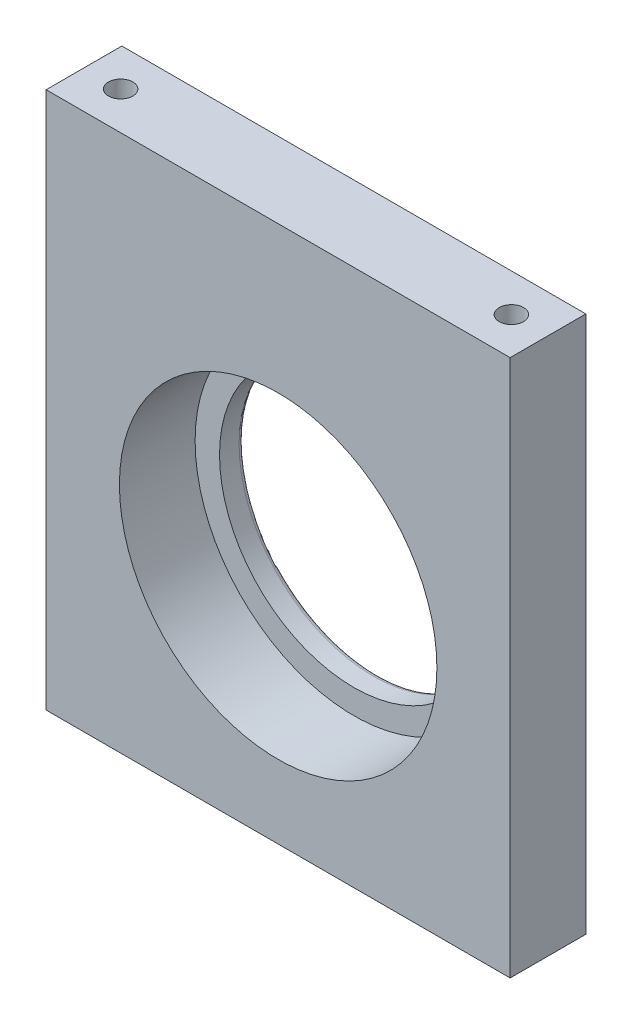
ISO-10303-21;
HEADER;
FILE_DESCRIPTION(('STEP AP214'),'2;1');
FILE_NAME('part.step','',(''),(''),'','','');
FILE_SCHEMA(('AUTOMOTIVE_DESIGN { 1 0 10303 214 1 1 1 1 }'));
ENDSEC;
DATA;
#1=APPLICATION_CONTEXT('core data for automotive mechanical design processes');
#2=APPLICATION_PROTOCOL_DEFINITION('international standard','automotive_design',2000,#1);
#3=PRODUCT_CONTEXT('',#1,'mechanical');
#4=PRODUCT('Part','Part','',(#3));
#5=PRODUCT_RELATED_PRODUCT_CATEGORY('part','',(#4));
#6=PRODUCT_DEFINITION_FORMATION('','',#4);
#7=PRODUCT_DEFINITION_CONTEXT('part definition',#1,'design');
#8=PRODUCT_DEFINITION('design','',#6,#7);
#9=PRODUCT_DEFINITION_SHAPE('','',#8);
#10=(LENGTH_UNIT() NAMED_UNIT(*) SI_UNIT(.MILLI.,.METRE.));
#11=(NAMED_UNIT(*) PLANE_ANGLE_UNIT() SI_UNIT($,.RADIAN.));
#12=(NAMED_UNIT(*) SI_UNIT($,.STERADIAN.) SOLID_ANGLE_UNIT());
#13=UNCERTAINTY_MEASURE_WITH_UNIT(LENGTH_MEASURE(1.E-05),#10,'distance_accuracy_value','');
#14=(GEOMETRIC_REPRESENTATION_CONTEXT(3) GLOBAL_UNCERTAINTY_ASSIGNED_CONTEXT((#13)) GLOBAL_UNIT_ASSIGNED_CONTEXT((#10,
#11,#12)) REPRESENTATION_CONTEXT('',''));
#15=CARTESIAN_POINT('',(0.,0.,0.));
#16=DIRECTION('',(0.,0.,1.));
#17=DIRECTION('',(1.,0.,0.));
#18=AXIS2_PLACEMENT_3D('',#15,#16,#17);
#19=CARTESIAN_POINT('',(0.,0.,31.));
#20=DIRECTION('',(0.,0.,1.));
#21=DIRECTION('',(1.,0.,0.));
#22=AXIS2_PLACEMENT_3D('',#19,#20,#21);
#23=PLANE('',#22);
#24=DIRECTION('',(0.,1.,0.));
#25=VECTOR('',#24,1.);
#26=CARTESIAN_POINT('',(95.,0.,31.));
#27=LINE('',#26,#25);
#28=CARTESIAN_POINT('',(95.,0.,31.));
#29=VERTEX_POINT('',#28);
#30=CARTESIAN_POINT('',(95.,220.,31.));
#31=VERTEX_POINT('',#30);
#32=EDGE_CURVE('E165',#29,#31,#27,.T.);
#33=ORIENTED_EDGE('',*,*,#32,.T.);
#34=DIRECTION('',(-1.,0.,0.));
#35=VECTOR('',#34,1.);
#36=CARTESIAN_POINT('',(95.,220.,31.));
#37=LINE('',#36,#35);
#38=CARTESIAN_POINT('',(-95.,220.,31.));
#39=VERTEX_POINT('',#38);
#40=EDGE_CURVE('E168',#31,#39,#37,.T.);
#41=ORIENTED_EDGE('',*,*,#40,.T.);
#42=DIRECTION('',(0.,-1.,0.));
#43=VECTOR('',#42,1.);
#44=CARTESIAN_POINT('',(-95.,220.,31.));
#45=LINE('',#44,#43);
#46=CARTESIAN_POINT('',(-95.,0.,31.));
#47=VERTEX_POINT('',#46);
#48=EDGE_CURVE('E171',#39,#47,#45,.T.);
#49=ORIENTED_EDGE('',*,*,#48,.T.);
#50=DIRECTION('',(1.,0.,0.));
#51=VECTOR('',#50,1.);
#52=CARTESIAN_POINT('',(-95.,0.,31.));
#53=LINE('',#52,#51);
#54=EDGE_CURVE('E173',#47,#29,#53,.T.);
#55=ORIENTED_EDGE('',*,*,#54,.T.);
#56=EDGE_LOOP('',(#33,#41,#49,#55));
#57=FACE_BOUND('',#56,.T.);
#58=CARTESIAN_POINT('',(0.,95.,31.));
#59=DIRECTION('',(0.,0.,1.));
#60=DIRECTION('',(1.,0.,0.));
#61=AXIS2_PLACEMENT_3D('',#58,#59,#60);
#62=CIRCLE('',#61,65.);
#63=CARTESIAN_POINT('',(65.,95.,31.));
#64=VERTEX_POINT('',#63);
#65=EDGE_CURVE('E159',#64,#64,#62,.T.);
#66=ORIENTED_EDGE('',*,*,#65,.F.);
#67=EDGE_LOOP('',(#66));
#68=FACE_BOUND('',#67,.T.);
#69=ADVANCED_FACE('F33',(#57,#68),#23,.T.);
#70=CARTESIAN_POINT('',(0.,0.,0.));
#71=DIRECTION('',(0.,0.,1.));
#72=DIRECTION('',(1.,0.,0.));
#73=AXIS2_PLACEMENT_3D('',#70,#71,#72);
#74=PLANE('',#73);
#75=DIRECTION('',(1.,0.,0.));
#76=VECTOR('',#75,1.);
#77=CARTESIAN_POINT('',(0.,18.,0.));
#78=LINE('',#77,#76);
#79=CARTESIAN_POINT('',(-77.,18.,0.));
#80=VERTEX_POINT('',#79);
#81=CARTESIAN_POINT('',(77.,18.,0.));
#82=VERTEX_POINT('',#81);
#83=EDGE_CURVE('E204',#80,#82,#78,.T.);
#84=ORIENTED_EDGE('',*,*,#83,.T.);
#85=DIRECTION('',(0.,1.,0.));
#86=VECTOR('',#85,1.);
#87=CARTESIAN_POINT('',(77.,0.,0.));
#88=LINE('',#87,#86);
#89=CARTESIAN_POINT('',(77.,172.,0.));
#90=VERTEX_POINT('',#89);
#91=EDGE_CURVE('E206',#82,#90,#88,.T.);
#92=ORIENTED_EDGE('',*,*,#91,.T.);
#93=DIRECTION('',(-1.,0.,0.));
#94=VECTOR('',#93,1.);
#95=CARTESIAN_POINT('',(0.,172.,0.));
#96=LINE('',#95,#94);
#97=CARTESIAN_POINT('',(-77.,172.,0.));
#98=VERTEX_POINT('',#97);
#99=EDGE_CURVE('E200',#90,#98,#96,.T.);
#100=ORIENTED_EDGE('',*,*,#99,.T.);
#101=DIRECTION('',(0.,-1.,0.));
#102=VECTOR('',#101,1.);
#103=CARTESIAN_POINT('',(-77.,0.,0.));
#104=LINE('',#103,#102);
#105=EDGE_CURVE('E202',#98,#80,#104,.T.);
#106=ORIENTED_EDGE('',*,*,#105,.T.);
#107=EDGE_LOOP('',(#84,#92,#100,#106));
#108=FACE_BOUND('',#107,.T.);
#109=DIRECTION('',(0.,1.,0.));
#110=VECTOR('',#109,1.);
#111=CARTESIAN_POINT('',(95.,0.,0.));
#112=LINE('',#111,#110);
#113=CARTESIAN_POINT('',(95.,0.,0.));
#114=VERTEX_POINT('',#113);
#115=CARTESIAN_POINT('',(95.,220.,0.));
#116=VERTEX_POINT('',#115);
#117=EDGE_CURVE('E162',#114,#116,#112,.T.);
#118=ORIENTED_EDGE('',*,*,#117,.F.);
#119=DIRECTION('',(1.,0.,0.));
#120=VECTOR('',#119,1.);
#121=CARTESIAN_POINT('',(-95.,0.,0.));
#122=LINE('',#121,#120);
#123=CARTESIAN_POINT('',(-95.,0.,0.));
#124=VERTEX_POINT('',#123);
#125=EDGE_CURVE('E169',#124,#114,#122,.T.);
#126=ORIENTED_EDGE('',*,*,#125,.F.);
#127=DIRECTION('',(0.,-1.,0.));
#128=VECTOR('',#127,1.);
#129=CARTESIAN_POINT('',(-95.,220.,0.));
#130=LINE('',#129,#128);
#131=CARTESIAN_POINT('',(-95.,220.,0.));
#132=VERTEX_POINT('',#131);
#133=EDGE_CURVE('E180',#132,#124,#130,.T.);
#134=ORIENTED_EDGE('',*,*,#133,.F.);
#135=DIRECTION('',(-1.,0.,0.));
#136=VECTOR('',#135,1.);
#137=CARTESIAN_POINT('',(95.,220.,0.));
#138=LINE('',#137,#136);
#139=EDGE_CURVE('E178',#116,#132,#138,.T.);
#140=ORIENTED_EDGE('',*,*,#139,.F.);
#141=EDGE_LOOP('',(#118,#126,#134,#140));
#142=FACE_BOUND('',#141,.T.);
#143=ADVANCED_FACE('F245',(#108,#142),#74,.F.);
#144=CARTESIAN_POINT('',(95.,0.,31.));
#145=DIRECTION('',(-1.,0.,0.));
#146=DIRECTION('',(0.,-1.,0.));
#147=AXIS2_PLACEMENT_3D('',#144,#145,#146);
#148=PLANE('',#147);
#149=ORIENTED_EDGE('',*,*,#117,.T.);
#150=DIRECTION('',(0.,0.,-1.));
#151=VECTOR('',#150,1.);
#152=CARTESIAN_POINT('',(95.,220.,31.));
#153=LINE('',#152,#151);
#154=EDGE_CURVE('E191',#31,#116,#153,.T.);
#155=ORIENTED_EDGE('',*,*,#154,.F.);
#156=ORIENTED_EDGE('',*,*,#32,.F.);
#157=DIRECTION('',(0.,0.,-1.));
#158=VECTOR('',#157,1.);
#159=CARTESIAN_POINT('',(95.,0.,31.));
#160=LINE('',#159,#158);
#161=EDGE_CURVE('E175',#29,#114,#160,.T.);
#162=ORIENTED_EDGE('',*,*,#161,.T.);
#163=EDGE_LOOP('',(#149,#155,#156,#162));
#164=FACE_BOUND('',#163,.T.);
#165=ADVANCED_FACE('F251',(#164),#148,.F.);
#166=CARTESIAN_POINT('',(95.,220.,31.));
#167=DIRECTION('',(0.,-1.,0.));
#168=DIRECTION('',(1.,0.,0.));
#169=AXIS2_PLACEMENT_3D('',#166,#167,#168);
#170=PLANE('',#169);
#171=CARTESIAN_POINT('',(80.,220.,15.5));
#172=DIRECTION('',(0.,-1.,0.));
#173=DIRECTION('',(1.,0.,0.));
#174=AXIS2_PLACEMENT_3D('',#171,#172,#173);
#175=CIRCLE('',#174,5.);
#176=CARTESIAN_POINT('',(75.,220.,15.5));
#177=VERTEX_POINT('',#176);
#178=EDGE_CURVE('E143',#177,#177,#175,.T.);
#179=ORIENTED_EDGE('',*,*,#178,.T.);
#180=EDGE_LOOP('',(#179));
#181=FACE_BOUND('',#180,.T.);
#182=CARTESIAN_POINT('',(-80.,220.,15.5));
#183=DIRECTION('',(0.,1.,0.));
#184=DIRECTION('',(-1.,0.,0.));
#185=AXIS2_PLACEMENT_3D('',#182,#183,#184);
#186=CIRCLE('',#185,5.);
#187=CARTESIAN_POINT('',(-85.,220.,15.5));
#188=VERTEX_POINT('',#187);
#189=EDGE_CURVE('E150',#188,#188,#186,.T.);
#190=ORIENTED_EDGE('',*,*,#189,.F.);
#191=EDGE_LOOP('',(#190));
#192=FACE_BOUND('',#191,.T.);
#193=ORIENTED_EDGE('',*,*,#139,.T.);
#194=DIRECTION('',(0.,0.,-1.));
#195=VECTOR('',#194,1.);
#196=CARTESIAN_POINT('',(-95.,220.,31.));
#197=LINE('',#196,#195);
#198=EDGE_CURVE('E188',#39,#132,#197,.T.);
#199=ORIENTED_EDGE('',*,*,#198,.F.);
#200=ORIENTED_EDGE('',*,*,#40,.F.);
#201=ORIENTED_EDGE('',*,*,#154,.T.);
#202=EDGE_LOOP('',(#193,#199,#200,#201));
#203=FACE_BOUND('',#202,.T.);
#204=ADVANCED_FACE('F266',(#181,#192,#203),#170,.F.);
#205=CARTESIAN_POINT('',(-95.,220.,31.));
#206=DIRECTION('',(1.,0.,0.));
#207=DIRECTION('',(0.,1.,0.));
#208=AXIS2_PLACEMENT_3D('',#205,#206,#207);
#209=PLANE('',#208);
#210=ORIENTED_EDGE('',*,*,#133,.T.);
#211=DIRECTION('',(0.,0.,-1.));
#212=VECTOR('',#211,1.);
#213=CARTESIAN_POINT('',(-95.,0.,31.));
#214=LINE('',#213,#212);
#215=EDGE_CURVE('E185',#47,#124,#214,.T.);
#216=ORIENTED_EDGE('',*,*,#215,.F.);
#217=ORIENTED_EDGE('',*,*,#48,.F.);
#218=ORIENTED_EDGE('',*,*,#198,.T.);
#219=EDGE_LOOP('',(#210,#216,#217,#218));
#220=FACE_BOUND('',#219,.T.);
#221=ADVANCED_FACE('F262',(#220),#209,.F.);
#222=CARTESIAN_POINT('',(-95.,0.,31.));
#223=DIRECTION('',(0.,1.,0.));
#224=DIRECTION('',(0.,0.,1.));
#225=AXIS2_PLACEMENT_3D('',#222,#223,#224);
#226=PLANE('',#225);
#227=ORIENTED_EDGE('',*,*,#125,.T.);
#228=ORIENTED_EDGE('',*,*,#161,.F.);
#229=ORIENTED_EDGE('',*,*,#54,.F.);
#230=ORIENTED_EDGE('',*,*,#215,.T.);
#231=EDGE_LOOP('',(#227,#228,#229,#230));
#232=FACE_BOUND('',#231,.T.);
#233=ADVANCED_FACE('F259',(#232),#226,.F.);
#234=CARTESIAN_POINT('',(0.,95.,31.));
#235=DIRECTION('',(0.,0.,-1.));
#236=DIRECTION('',(-1.,0.,0.));
#237=AXIS2_PLACEMENT_3D('',#234,#235,#236);
#238=CYLINDRICAL_SURFACE('',#237,65.);
#239=ORIENTED_EDGE('',*,*,#65,.T.);
#240=EDGE_LOOP('',(#239));
#241=FACE_BOUND('',#240,.T.);
#242=CARTESIAN_POINT('',(0.,95.,0.));
#243=DIRECTION('',(0.,0.,1.));
#244=DIRECTION('',(1.,0.,0.));
#245=AXIS2_PLACEMENT_3D('',#242,#243,#244);
#246=CIRCLE('',#245,65.);
#247=CARTESIAN_POINT('',(65.,95.,0.));
#248=VERTEX_POINT('',#247);
#249=EDGE_CURVE('E156',#248,#248,#246,.T.);
#250=ORIENTED_EDGE('',*,*,#249,.F.);
#251=EDGE_LOOP('',(#250));
#252=FACE_BOUND('',#251,.T.);
#253=ADVANCED_FACE('F256',(#241,#252),#238,.F.);
#254=CARTESIAN_POINT('',(-80.,205.,15.5));
#255=DIRECTION('',(0.,1.,0.));
#256=DIRECTION('',(-1.,0.,0.));
#257=AXIS2_PLACEMENT_3D('',#254,#255,#256);
#258=CYLINDRICAL_SURFACE('',#257,5.);
#259=CARTESIAN_POINT('',(-80.,205.,15.5));
#260=DIRECTION('',(0.,1.,0.));
#261=DIRECTION('',(-1.,0.,0.));
#262=AXIS2_PLACEMENT_3D('',#259,#260,#261);
#263=CIRCLE('',#262,5.);
#264=CARTESIAN_POINT('',(-85.,205.,15.5));
#265=VERTEX_POINT('',#264);
#266=EDGE_CURVE('E153',#265,#265,#263,.T.);
#267=CARTESIAN_POINT('',(-85.,205.,15.5));
#268=CARTESIAN_POINT('',(-85.,205.15625,15.5));
#269=CARTESIAN_POINT('',(-85.,205.3125,15.5));
#270=CARTESIAN_POINT('',(-85.,205.625,15.5));
#271=CARTESIAN_POINT('',(-85.,205.78125,15.5));
#272=CARTESIAN_POINT('',(-85.,206.09375,15.5));
#273=CARTESIAN_POINT('',(-85.,206.25,15.5));
#274=CARTESIAN_POINT('',(-85.,206.5625,15.5));
#275=CARTESIAN_POINT('',(-85.,206.71875,15.5));
#276=CARTESIAN_POINT('',(-85.,207.03125,15.5));
#277=CARTESIAN_POINT('',(-85.,207.1875,15.5));
#278=CARTESIAN_POINT('',(-85.,207.5,15.5));
#279=CARTESIAN_POINT('',(-85.,207.65625,15.5));
#280=CARTESIAN_POINT('',(-85.,207.96875,15.5));
#281=CARTESIAN_POINT('',(-85.,208.125,15.5));
#282=CARTESIAN_POINT('',(-85.,208.4375,15.5));
#283=CARTESIAN_POINT('',(-85.,208.59375,15.5));
#284=CARTESIAN_POINT('',(-85.,208.90625,15.5));
#285=CARTESIAN_POINT('',(-85.,209.0625,15.5));
#286=CARTESIAN_POINT('',(-85.,209.375,15.5));
#287=CARTESIAN_POINT('',(-85.,209.53125,15.5));
#288=CARTESIAN_POINT('',(-85.,209.84375,15.5));
#289=CARTESIAN_POINT('',(-85.,210.,15.5));
#290=CARTESIAN_POINT('',(-85.,210.3125,15.5));
#291=CARTESIAN_POINT('',(-85.,210.46875,15.5));
#292=CARTESIAN_POINT('',(-85.,210.78125,15.5));
#293=CARTESIAN_POINT('',(-85.,210.9375,15.5));
#294=CARTESIAN_POINT('',(-85.,211.25,15.5));
#295=CARTESIAN_POINT('',(-85.,211.40625,15.5));
#296=CARTESIAN_POINT('',(-85.,211.71875,15.5));
#297=CARTESIAN_POINT('',(-85.,211.875,15.5));
#298=CARTESIAN_POINT('',(-85.,212.1875,15.5));
#299=CARTESIAN_POINT('',(-85.,212.34375,15.5));
#300=CARTESIAN_POINT('',(-85.,212.65625,15.5));
#301=CARTESIAN_POINT('',(-85.,212.8125,15.5));
#302=CARTESIAN_POINT('',(-85.,213.125,15.5));
#303=CARTESIAN_POINT('',(-85.,213.28125,15.5));
#304=CARTESIAN_POINT('',(-85.,213.59375,15.5));
#305=CARTESIAN_POINT('',(-85.,213.75,15.5));
#306=CARTESIAN_POINT('',(-85.,214.0625,15.5));
#307=CARTESIAN_POINT('',(-85.,214.21875,15.5));
#308=CARTESIAN_POINT('',(-85.,214.53125,15.5));
#309=CARTESIAN_POINT('',(-85.,214.6875,15.5));
#310=CARTESIAN_POINT('',(-85.,215.,15.5));
#311=CARTESIAN_POINT('',(-85.,215.15625,15.5));
#312=CARTESIAN_POINT('',(-85.,215.46875,15.5));
#313=CARTESIAN_POINT('',(-85.,215.625,15.5));
#314=CARTESIAN_POINT('',(-85.,215.9375,15.5));
#315=CARTESIAN_POINT('',(-85.,216.09375,15.5));
#316=CARTESIAN_POINT('',(-85.,216.40625,15.5));
#317=CARTESIAN_POINT('',(-85.,216.5625,15.5));
#318=CARTESIAN_POINT('',(-85.,216.875,15.5));
#319=CARTESIAN_POINT('',(-85.,217.03125,15.5));
#320=CARTESIAN_POINT('',(-85.,217.34375,15.5));
#321=CARTESIAN_POINT('',(-85.,217.5,15.5));
#322=CARTESIAN_POINT('',(-85.,217.8125,15.5));
#323=CARTESIAN_POINT('',(-85.,217.96875,15.5));
#324=CARTESIAN_POINT('',(-85.,218.28125,15.5));
#325=CARTESIAN_POINT('',(-85.,218.4375,15.5));
#326=CARTESIAN_POINT('',(-85.,218.75,15.5));
#327=CARTESIAN_POINT('',(-85.,218.90625,15.5));
#328=CARTESIAN_POINT('',(-85.,219.21875,15.5));
#329=CARTESIAN_POINT('',(-85.,219.375,15.5));
#330=CARTESIAN_POINT('',(-85.,219.6875,15.5));
#331=CARTESIAN_POINT('',(-85.,219.84375,15.5));
#332=CARTESIAN_POINT('',(-85.,220.,15.5));
#333=B_SPLINE_CURVE_WITH_KNOTS('',3,(#267,#268,#269,#270,#271,#272,#273,#274,#275,#276,#277,
#278,#279,#280,#281,#282,#283,#284,#285,#286,#287,#288,#289,#290,#291,#292,#293,#294,#295,#296,
#297,#298,#299,#300,#301,#302,#303,#304,#305,#306,#307,#308,#309,#310,#311,#312,#313,#314,#315,
#316,#317,#318,#319,#320,#321,#322,#323,#324,#325,#326,#327,#328,#329,#330,#331,#332),
.UNSPECIFIED.,.F.,.F.,(4,2,2,2,2,2,2,2,2,2,2,2,2,2,2,2,2,2,2,2,2,2,2,2,2,2,2,2,2,2,2,2,4),(0.,
0.468750000000018,0.937500000000008,1.40625000000003,1.87500000000002,2.34375000000001,
2.81250000000002,3.28125000000001,3.75000000000003,4.21875000000002,4.68750000000001,
5.15625000000003,5.62500000000002,6.09375000000001,6.56250000000003,7.03125000000002,
7.50000000000003,7.96875000000002,8.43750000000001,8.90625000000003,9.37500000000002,
9.84375000000001,10.3125,10.78125,11.25,11.71875,12.1875,12.65625,13.125,13.59375,14.0625,
14.53125,15.),.UNSPECIFIED.);
#334=EDGE_CURVE('BSEAM383',#265,#188,#333,.T.);
#335=ORIENTED_EDGE('',*,*,#266,.F.);
#336=ORIENTED_EDGE('',*,*,#189,.T.);
#337=ORIENTED_EDGE('',*,*,#334,.T.);
#338=ORIENTED_EDGE('',*,*,#334,.F.);
#339=EDGE_LOOP('',(#335,#337,#336,#338));
#340=FACE_BOUND('',#339,.T.);
#341=ADVANCED_FACE('F383',(#340),#258,.F.);
#342=CARTESIAN_POINT('',(-80.,205.,15.5));
#343=DIRECTION('',(0.,1.,0.));
#344=DIRECTION('',(-1.,0.,0.));
#345=AXIS2_PLACEMENT_3D('',#342,#343,#344);
#346=PLANE('',#345);
#347=ORIENTED_EDGE('',*,*,#266,.T.);
#348=EDGE_LOOP('',(#347));
#349=FACE_BOUND('',#348,.T.);
#350=ADVANCED_FACE('F366',(#349),#346,.T.);
#351=CARTESIAN_POINT('',(80.,205.,15.5));
#352=DIRECTION('',(0.,1.,0.));
#353=DIRECTION('',(-1.,0.,0.));
#354=AXIS2_PLACEMENT_3D('',#351,#352,#353);
#355=CYLINDRICAL_SURFACE('',#354,5.);
#356=CARTESIAN_POINT('',(80.,205.,15.5));
#357=DIRECTION('',(0.,-1.,0.));
#358=DIRECTION('',(1.,0.,0.));
#359=AXIS2_PLACEMENT_3D('',#356,#357,#358);
#360=CIRCLE('',#359,5.);
#361=CARTESIAN_POINT('',(75.,205.,15.5));
#362=VERTEX_POINT('',#361);
#363=EDGE_CURVE('E147',#362,#362,#360,.T.);
#364=CARTESIAN_POINT('',(75.,205.,15.5));
#365=CARTESIAN_POINT('',(75.,205.15625,15.5));
#366=CARTESIAN_POINT('',(75.,205.3125,15.5));
#367=CARTESIAN_POINT('',(75.,205.625,15.5));
#368=CARTESIAN_POINT('',(75.,205.78125,15.5));
#369=CARTESIAN_POINT('',(75.,206.09375,15.5));
#370=CARTESIAN_POINT('',(75.,206.25,15.5));
#371=CARTESIAN_POINT('',(75.,206.5625,15.5));
#372=CARTESIAN_POINT('',(75.,206.71875,15.5));
#373=CARTESIAN_POINT('',(75.,207.03125,15.5));
#374=CARTESIAN_POINT('',(75.,207.1875,15.5));
#375=CARTESIAN_POINT('',(75.,207.5,15.5));
#376=CARTESIAN_POINT('',(75.,207.65625,15.5));
#377=CARTESIAN_POINT('',(75.,207.96875,15.5));
#378=CARTESIAN_POINT('',(75.,208.125,15.5));
#379=CARTESIAN_POINT('',(75.,208.4375,15.5));
#380=CARTESIAN_POINT('',(75.,208.59375,15.5));
#381=CARTESIAN_POINT('',(75.,208.90625,15.5));
#382=CARTESIAN_POINT('',(75.,209.0625,15.5));
#383=CARTESIAN_POINT('',(75.,209.375,15.5));
#384=CARTESIAN_POINT('',(75.,209.53125,15.5));
#385=CARTESIAN_POINT('',(75.,209.84375,15.5));
#386=CARTESIAN_POINT('',(75.,210.,15.5));
#387=CARTESIAN_POINT('',(75.,210.3125,15.5));
#388=CARTESIAN_POINT('',(75.,210.46875,15.5));
#389=CARTESIAN_POINT('',(75.,210.78125,15.5));
#390=CARTESIAN_POINT('',(75.,210.9375,15.5));
#391=CARTESIAN_POINT('',(75.,211.25,15.5));
#392=CARTESIAN_POINT('',(75.,211.40625,15.5));
#393=CARTESIAN_POINT('',(75.,211.71875,15.5));
#394=CARTESIAN_POINT('',(75.,211.875,15.5));
#395=CARTESIAN_POINT('',(75.,212.1875,15.5));
#396=CARTESIAN_POINT('',(75.,212.34375,15.5));
#397=CARTESIAN_POINT('',(75.,212.65625,15.5));
#398=CARTESIAN_POINT('',(75.,212.8125,15.5));
#399=CARTESIAN_POINT('',(75.,213.125,15.5));
#400=CARTESIAN_POINT('',(75.,213.28125,15.5));
#401=CARTESIAN_POINT('',(75.,213.59375,15.5));
#402=CARTESIAN_POINT('',(75.,213.75,15.5));
#403=CARTESIAN_POINT('',(75.,214.0625,15.5));
#404=CARTESIAN_POINT('',(75.,214.21875,15.5));
#405=CARTESIAN_POINT('',(75.,214.53125,15.5));
#406=CARTESIAN_POINT('',(75.,214.6875,15.5));
#407=CARTESIAN_POINT('',(75.,215.,15.5));
#408=CARTESIAN_POINT('',(75.,215.15625,15.5));
#409=CARTESIAN_POINT('',(75.,215.46875,15.5));
#410=CARTESIAN_POINT('',(75.,215.625,15.5));
#411=CARTESIAN_POINT('',(75.,215.9375,15.5));
#412=CARTESIAN_POINT('',(75.,216.09375,15.5));
#413=CARTESIAN_POINT('',(75.,216.40625,15.5));
#414=CARTESIAN_POINT('',(75.,216.5625,15.5));
#415=CARTESIAN_POINT('',(75.,216.875,15.5));
#416=CARTESIAN_POINT('',(75.,217.03125,15.5));
#417=CARTESIAN_POINT('',(75.,217.34375,15.5));
#418=CARTESIAN_POINT('',(75.,217.5,15.5));
#419=CARTESIAN_POINT('',(75.,217.8125,15.5));
#420=CARTESIAN_POINT('',(75.,217.96875,15.5));
#421=CARTESIAN_POINT('',(75.,218.28125,15.5));
#422=CARTESIAN_POINT('',(75.,218.4375,15.5));
#423=CARTESIAN_POINT('',(75.,218.75,15.5));
#424=CARTESIAN_POINT('',(75.,218.90625,15.5));
#425=CARTESIAN_POINT('',(75.,219.21875,15.5));
#426=CARTESIAN_POINT('',(75.,219.375,15.5));
#427=CARTESIAN_POINT('',(75.,219.6875,15.5));
#428=CARTESIAN_POINT('',(75.,219.84375,15.5));
#429=CARTESIAN_POINT('',(75.,220.,15.5));
#430=B_SPLINE_CURVE_WITH_KNOTS('',3,(#364,#365,#366,#367,#368,#369,#370,#371,#372,#373,#374,
#375,#376,#377,#378,#379,#380,#381,#382,#383,#384,#385,#386,#387,#388,#389,#390,#391,#392,#393,
#394,#395,#396,#397,#398,#399,#400,#401,#402,#403,#404,#405,#406,#407,#408,#409,#410,#411,#412,
#413,#414,#415,#416,#417,#418,#419,#420,#421,#422,#423,#424,#425,#426,#427,#428,#429),
.UNSPECIFIED.,.F.,.F.,(4,2,2,2,2,2,2,2,2,2,2,2,2,2,2,2,2,2,2,2,2,2,2,2,2,2,2,2,2,2,2,2,4),(0.,
0.468750000000018,0.937500000000008,1.40625000000003,1.87500000000002,2.34375000000001,
2.81250000000002,3.28125000000001,3.75,4.21875000000002,4.68750000000001,5.15625000000003,
5.62500000000002,6.09375000000001,6.56250000000003,7.03125000000002,7.50000000000001,
7.96875000000002,8.43750000000001,8.90625000000003,9.37500000000002,9.84375000000001,10.3125,
10.78125,11.25,11.71875,12.1875,12.65625,13.125,13.59375,14.0625,14.53125,15.),.UNSPECIFIED.);
#431=EDGE_CURVE('BSEAM356',#362,#177,#430,.T.);
#432=ORIENTED_EDGE('',*,*,#363,.T.);
#433=ORIENTED_EDGE('',*,*,#178,.F.);
#434=ORIENTED_EDGE('',*,*,#431,.T.);
#435=ORIENTED_EDGE('',*,*,#431,.F.);
#436=EDGE_LOOP('',(#432,#434,#433,#435));
#437=FACE_BOUND('',#436,.T.);
#438=ADVANCED_FACE('F356',(#437),#355,.F.);
#439=CARTESIAN_POINT('',(80.,205.,15.5));
#440=DIRECTION('',(0.,1.,0.));
#441=DIRECTION('',(1.,0.,0.));
#442=AXIS2_PLACEMENT_3D('',#439,#440,#441);
#443=PLANE('',#442);
#444=ORIENTED_EDGE('',*,*,#363,.F.);
#445=EDGE_LOOP('',(#444));
#446=FACE_BOUND('',#445,.T.);
#447=ADVANCED_FACE('F346',(#446),#443,.T.);
#448=CARTESIAN_POINT('',(0.,0.,0.));
#449=DIRECTION('',(0.,0.,-1.));
#450=DIRECTION('',(-1.,0.,0.));
#451=AXIS2_PLACEMENT_3D('',#448,#449,#450);
#452=PLANE('',#451);
#453=CARTESIAN_POINT('',(0.,95.,0.));
#454=DIRECTION('',(0.,0.,1.));
#455=DIRECTION('',(1.,0.,0.));
#456=AXIS2_PLACEMENT_3D('',#453,#454,#455);
#457=CIRCLE('',#456,55.);
#458=CARTESIAN_POINT('',(55.,95.,0.));
#459=VERTEX_POINT('',#458);
#460=EDGE_CURVE('E135',#459,#459,#457,.T.);
#461=ORIENTED_EDGE('',*,*,#460,.F.);
#462=EDGE_LOOP('',(#461));
#463=FACE_BOUND('',#462,.T.);
#464=ORIENTED_EDGE('',*,*,#249,.T.);
#465=EDGE_LOOP('',(#464));
#466=FACE_BOUND('',#465,.T.);
#467=ADVANCED_FACE('F329',(#463,#466),#452,.F.);
#468=CARTESIAN_POINT('',(75.,20.,-10.));
#469=DIRECTION('',(1.,0.,0.));
#470=DIRECTION('',(0.,0.,-1.));
#471=AXIS2_PLACEMENT_3D('',#468,#469,#470);
#472=PLANE('',#471);
#473=DIRECTION('',(0.,0.,1.));
#474=VECTOR('',#473,1.);
#475=CARTESIAN_POINT('',(75.,170.,-10.));
#476=LINE('',#475,#474);
#477=CARTESIAN_POINT('',(75.,170.,-10.));
#478=VERTEX_POINT('',#477);
#479=CARTESIAN_POINT('',(75.,170.,-2.));
#480=VERTEX_POINT('',#479);
#481=EDGE_CURVE('E111',#478,#480,#476,.T.);
#482=ORIENTED_EDGE('',*,*,#481,.T.);
#483=DIRECTION('',(0.,1.,0.));
#484=VECTOR('',#483,1.);
#485=CARTESIAN_POINT('',(75.,20.,-2.));
#486=LINE('',#485,#484);
#487=CARTESIAN_POINT('',(75.,20.,-2.));
#488=VERTEX_POINT('',#487);
#489=EDGE_CURVE('E209',#480,#488,#486,.F.);
#490=ORIENTED_EDGE('',*,*,#489,.T.);
#491=DIRECTION('',(0.,0.,1.));
#492=VECTOR('',#491,1.);
#493=CARTESIAN_POINT('',(75.,20.,-10.));
#494=LINE('',#493,#492);
#495=CARTESIAN_POINT('',(75.,20.,-10.));
#496=VERTEX_POINT('',#495);
#497=EDGE_CURVE('E134',#496,#488,#494,.T.);
#498=ORIENTED_EDGE('',*,*,#497,.F.);
#499=DIRECTION('',(0.,1.,0.));
#500=VECTOR('',#499,1.);
#501=CARTESIAN_POINT('',(75.,20.,-10.));
#502=LINE('',#501,#500);
#503=EDGE_CURVE('E128',#496,#478,#502,.T.);
#504=ORIENTED_EDGE('',*,*,#503,.T.);
#505=EDGE_LOOP('',(#482,#490,#498,#504));
#506=FACE_BOUND('',#505,.T.);
#507=ADVANCED_FACE('F133',(#506),#472,.T.);
#508=CARTESIAN_POINT('',(-75.,20.,-10.));
#509=DIRECTION('',(0.,-1.,0.));
#510=DIRECTION('',(0.,0.,-1.));
#511=AXIS2_PLACEMENT_3D('',#508,#509,#510);
#512=PLANE('',#511);
#513=ORIENTED_EDGE('',*,*,#497,.T.);
#514=DIRECTION('',(1.,0.,0.));
#515=VECTOR('',#514,1.);
#516=CARTESIAN_POINT('',(-75.,20.,-2.));
#517=LINE('',#516,#515);
#518=CARTESIAN_POINT('',(-75.,20.,-2.));
#519=VERTEX_POINT('',#518);
#520=EDGE_CURVE('E57',#488,#519,#517,.F.);
#521=ORIENTED_EDGE('',*,*,#520,.T.);
#522=DIRECTION('',(0.,0.,1.));
#523=VECTOR('',#522,1.);
#524=CARTESIAN_POINT('',(-75.,20.,-10.));
#525=LINE('',#524,#523);
#526=CARTESIAN_POINT('',(-75.,20.,-10.));
#527=VERTEX_POINT('',#526);
#528=EDGE_CURVE('E144',#527,#519,#525,.T.);
#529=ORIENTED_EDGE('',*,*,#528,.F.);
#530=DIRECTION('',(1.,0.,0.));
#531=VECTOR('',#530,1.);
#532=CARTESIAN_POINT('',(-75.,20.,-10.));
#533=LINE('',#532,#531);
#534=EDGE_CURVE('E121',#527,#496,#533,.T.);
#535=ORIENTED_EDGE('',*,*,#534,.T.);
#536=EDGE_LOOP('',(#513,#521,#529,#535));
#537=FACE_BOUND('',#536,.T.);
#538=ADVANCED_FACE('F234',(#537),#512,.T.);
#539=CARTESIAN_POINT('',(-75.,20.,-10.));
#540=DIRECTION('',(-1.,0.,0.));
#541=DIRECTION('',(0.,0.,1.));
#542=AXIS2_PLACEMENT_3D('',#539,#540,#541);
#543=PLANE('',#542);
#544=ORIENTED_EDGE('',*,*,#528,.T.);
#545=DIRECTION('',(0.,-1.,0.));
#546=VECTOR('',#545,1.);
#547=CARTESIAN_POINT('',(-75.,20.,-2.));
#548=LINE('',#547,#546);
#549=CARTESIAN_POINT('',(-75.,170.,-2.));
#550=VERTEX_POINT('',#549);
#551=EDGE_CURVE('E42',#519,#550,#548,.F.);
#552=ORIENTED_EDGE('',*,*,#551,.T.);
#553=DIRECTION('',(0.,0.,1.));
#554=VECTOR('',#553,1.);
#555=CARTESIAN_POINT('',(-75.,170.,-10.));
#556=LINE('',#555,#554);
#557=CARTESIAN_POINT('',(-75.,170.,-10.));
#558=VERTEX_POINT('',#557);
#559=EDGE_CURVE('E120',#558,#550,#556,.T.);
#560=ORIENTED_EDGE('',*,*,#559,.F.);
#561=DIRECTION('',(0.,-1.,0.));
#562=VECTOR('',#561,1.);
#563=CARTESIAN_POINT('',(-75.,20.,-10.));
#564=LINE('',#563,#562);
#565=EDGE_CURVE('E131',#558,#527,#564,.T.);
#566=ORIENTED_EDGE('',*,*,#565,.T.);
#567=EDGE_LOOP('',(#544,#552,#560,#566));
#568=FACE_BOUND('',#567,.T.);
#569=ADVANCED_FACE('F235',(#568),#543,.T.);
#570=CARTESIAN_POINT('',(-75.,170.,-10.));
#571=DIRECTION('',(0.,1.,0.));
#572=DIRECTION('',(0.,0.,1.));
#573=AXIS2_PLACEMENT_3D('',#570,#571,#572);
#574=PLANE('',#573);
#575=ORIENTED_EDGE('',*,*,#559,.T.);
#576=DIRECTION('',(-1.,0.,0.));
#577=VECTOR('',#576,1.);
#578=CARTESIAN_POINT('',(-75.,170.,-2.));
#579=LINE('',#578,#577);
#580=EDGE_CURVE('E11',#550,#480,#579,.F.);
#581=ORIENTED_EDGE('',*,*,#580,.T.);
#582=ORIENTED_EDGE('',*,*,#481,.F.);
#583=DIRECTION('',(-1.,0.,0.));
#584=VECTOR('',#583,1.);
#585=CARTESIAN_POINT('',(-75.,170.,-10.));
#586=LINE('',#585,#584);
#587=EDGE_CURVE('E114',#478,#558,#586,.T.);
#588=ORIENTED_EDGE('',*,*,#587,.T.);
#589=EDGE_LOOP('',(#575,#581,#582,#588));
#590=FACE_BOUND('',#589,.T.);
#591=ADVANCED_FACE('F113',(#590),#574,.T.);
#592=CARTESIAN_POINT('',(0.,0.,-10.));
#593=DIRECTION('',(0.,0.,-1.));
#594=DIRECTION('',(-1.,0.,0.));
#595=AXIS2_PLACEMENT_3D('',#592,#593,#594);
#596=PLANE('',#595);
#597=CARTESIAN_POINT('',(0.,95.,-10.));
#598=DIRECTION('',(0.,0.,-1.));
#599=DIRECTION('',(-1.,0.,0.));
#600=AXIS2_PLACEMENT_3D('',#597,#598,#599);
#601=CIRCLE('',#600,57.);
#602=CARTESIAN_POINT('',(-57.,95.,-10.));
#603=VERTEX_POINT('',#602);
#604=EDGE_CURVE('E194',#603,#603,#601,.F.);
#605=ORIENTED_EDGE('',*,*,#604,.T.);
#606=EDGE_LOOP('',(#605));
#607=FACE_BOUND('',#606,.T.);
#608=ORIENTED_EDGE('',*,*,#503,.F.);
#609=ORIENTED_EDGE('',*,*,#534,.F.);
#610=ORIENTED_EDGE('',*,*,#565,.F.);
#611=ORIENTED_EDGE('',*,*,#587,.F.);
#612=EDGE_LOOP('',(#608,#609,#610,#611));
#613=FACE_BOUND('',#612,.T.);
#614=ADVANCED_FACE('F126',(#607,#613),#596,.T.);
#615=CARTESIAN_POINT('',(0.,95.,-10.));
#616=DIRECTION('',(0.,0.,1.));
#617=DIRECTION('',(1.,0.,0.));
#618=AXIS2_PLACEMENT_3D('',#615,#616,#617);
#619=CYLINDRICAL_SURFACE('',#618,55.);
#620=CARTESIAN_POINT('',(0.,95.,-8.));
#621=DIRECTION('',(0.,0.,-1.));
#622=DIRECTION('',(-1.,0.,0.));
#623=AXIS2_PLACEMENT_3D('',#620,#621,#622);
#624=CIRCLE('',#623,55.);
#625=CARTESIAN_POINT('',(-55.,95.,-8.));
#626=VERTEX_POINT('',#625);
#627=EDGE_CURVE('E197',#626,#626,#624,.T.);
#628=ORIENTED_EDGE('',*,*,#627,.T.);
#629=EDGE_LOOP('',(#628));
#630=FACE_BOUND('',#629,.T.);
#631=ORIENTED_EDGE('',*,*,#460,.T.);
#632=EDGE_LOOP('',(#631));
#633=FACE_BOUND('',#632,.T.);
#634=ADVANCED_FACE('F277',(#630,#633),#619,.F.);
#635=CARTESIAN_POINT('',(0.,95.,-8.));
#636=DIRECTION('',(0.,0.,-1.));
#637=DIRECTION('',(-1.,0.,0.));
#638=AXIS2_PLACEMENT_3D('',#635,#636,#637);
#639=TOROIDAL_SURFACE('',#638,57.,2.);
#640=ORIENTED_EDGE('',*,*,#627,.F.);
#641=EDGE_LOOP('',(#640));
#642=FACE_BOUND('',#641,.T.);
#643=ORIENTED_EDGE('',*,*,#604,.F.);
#644=EDGE_LOOP('',(#643));
#645=FACE_BOUND('',#644,.T.);
#646=ADVANCED_FACE('F274',(#642,#645),#639,.T.);
#647=CARTESIAN_POINT('',(-77.,0.,-2.));
#648=DIRECTION('',(0.,-1.,0.));
#649=DIRECTION('',(0.,0.,-1.));
#650=AXIS2_PLACEMENT_3D('',#647,#648,#649);
#651=CYLINDRICAL_SURFACE('',#650,2.);
#652=CARTESIAN_POINT('',(-77.,172.,-2.));
#653=DIRECTION('',(-0.707106781186547,-0.707106781186547,0.));
#654=DIRECTION('',(-0.707106781186547,0.707106781186547,0.));
#655=AXIS2_PLACEMENT_3D('',#652,#653,#654);
#656=ELLIPSE('',#655,2.82842712474619,2.);
#657=EDGE_CURVE('E216',#550,#98,#656,.T.);
#658=ORIENTED_EDGE('',*,*,#657,.F.);
#659=ORIENTED_EDGE('',*,*,#551,.F.);
#660=CARTESIAN_POINT('',(-77.,18.,-2.));
#661=DIRECTION('',(0.707106781186547,-0.707106781186547,0.));
#662=DIRECTION('',(-0.707106781186547,-0.707106781186547,0.));
#663=AXIS2_PLACEMENT_3D('',#660,#661,#662);
#664=ELLIPSE('',#663,2.82842712474619,2.);
#665=EDGE_CURVE('E37',#80,#519,#664,.F.);
#666=ORIENTED_EDGE('',*,*,#665,.F.);
#667=ORIENTED_EDGE('',*,*,#105,.F.);
#668=EDGE_LOOP('',(#658,#659,#666,#667));
#669=FACE_BOUND('',#668,.T.);
#670=ADVANCED_FACE('F35',(#669),#651,.F.);
#671=CARTESIAN_POINT('',(0.,18.,-2.));
#672=DIRECTION('',(1.,0.,0.));
#673=DIRECTION('',(0.,0.,-1.));
#674=AXIS2_PLACEMENT_3D('',#671,#672,#673);
#675=CYLINDRICAL_SURFACE('',#674,2.);
#676=ORIENTED_EDGE('',*,*,#665,.T.);
#677=ORIENTED_EDGE('',*,*,#520,.F.);
#678=CARTESIAN_POINT('',(77.,18.,-2.));
#679=DIRECTION('',(0.707106781186547,0.707106781186547,0.));
#680=DIRECTION('',(0.707106781186547,-0.707106781186547,0.));
#681=AXIS2_PLACEMENT_3D('',#678,#679,#680);
#682=ELLIPSE('',#681,2.82842712474619,2.);
#683=EDGE_CURVE('E215',#82,#488,#682,.F.);
#684=ORIENTED_EDGE('',*,*,#683,.F.);
#685=ORIENTED_EDGE('',*,*,#83,.F.);
#686=EDGE_LOOP('',(#676,#677,#684,#685));
#687=FACE_BOUND('',#686,.T.);
#688=ADVANCED_FACE('F225',(#687),#675,.F.);
#689=CARTESIAN_POINT('',(0.,172.,-2.));
#690=DIRECTION('',(-1.,0.,0.));
#691=DIRECTION('',(0.,0.,1.));
#692=AXIS2_PLACEMENT_3D('',#689,#690,#691);
#693=CYLINDRICAL_SURFACE('',#692,2.);
#694=ORIENTED_EDGE('',*,*,#657,.T.);
#695=ORIENTED_EDGE('',*,*,#99,.F.);
#696=CARTESIAN_POINT('',(77.,172.,-2.));
#697=DIRECTION('',(-0.707106781186547,0.707106781186547,0.));
#698=DIRECTION('',(-0.707106781186547,-0.707106781186547,0.));
#699=AXIS2_PLACEMENT_3D('',#696,#697,#698);
#700=ELLIPSE('',#699,2.82842712474619,2.);
#701=EDGE_CURVE('E213',#480,#90,#700,.T.);
#702=ORIENTED_EDGE('',*,*,#701,.F.);
#703=ORIENTED_EDGE('',*,*,#580,.F.);
#704=EDGE_LOOP('',(#694,#695,#702,#703));
#705=FACE_BOUND('',#704,.T.);
#706=ADVANCED_FACE('F230',(#705),#693,.F.);
#707=CARTESIAN_POINT('',(77.,0.,-2.));
#708=DIRECTION('',(0.,1.,0.));
#709=DIRECTION('',(0.,0.,1.));
#710=AXIS2_PLACEMENT_3D('',#707,#708,#709);
#711=CYLINDRICAL_SURFACE('',#710,2.);
#712=ORIENTED_EDGE('',*,*,#683,.T.);
#713=ORIENTED_EDGE('',*,*,#489,.F.);
#714=ORIENTED_EDGE('',*,*,#701,.T.);
#715=ORIENTED_EDGE('',*,*,#91,.F.);
#716=EDGE_LOOP('',(#712,#713,#714,#715));
#717=FACE_BOUND('',#716,.T.);
#718=ADVANCED_FACE('F233',(#717),#711,.F.);
#719=CLOSED_SHELL('',(#69,#143,#165,#204,#221,#233,#253,#341,#350,#438,#447,#467,#507,#538,#569,
#591,#614,#634,#646,#670,#688,#706,#718));
#720=MANIFOLD_SOLID_BREP('B2',#719);
#721=ADVANCED_BREP_SHAPE_REPRESENTATION('',(#18,#720),#14);
#722=SHAPE_DEFINITION_REPRESENTATION(#9,#721);
ENDSEC;
END-ISO-10303-21;
